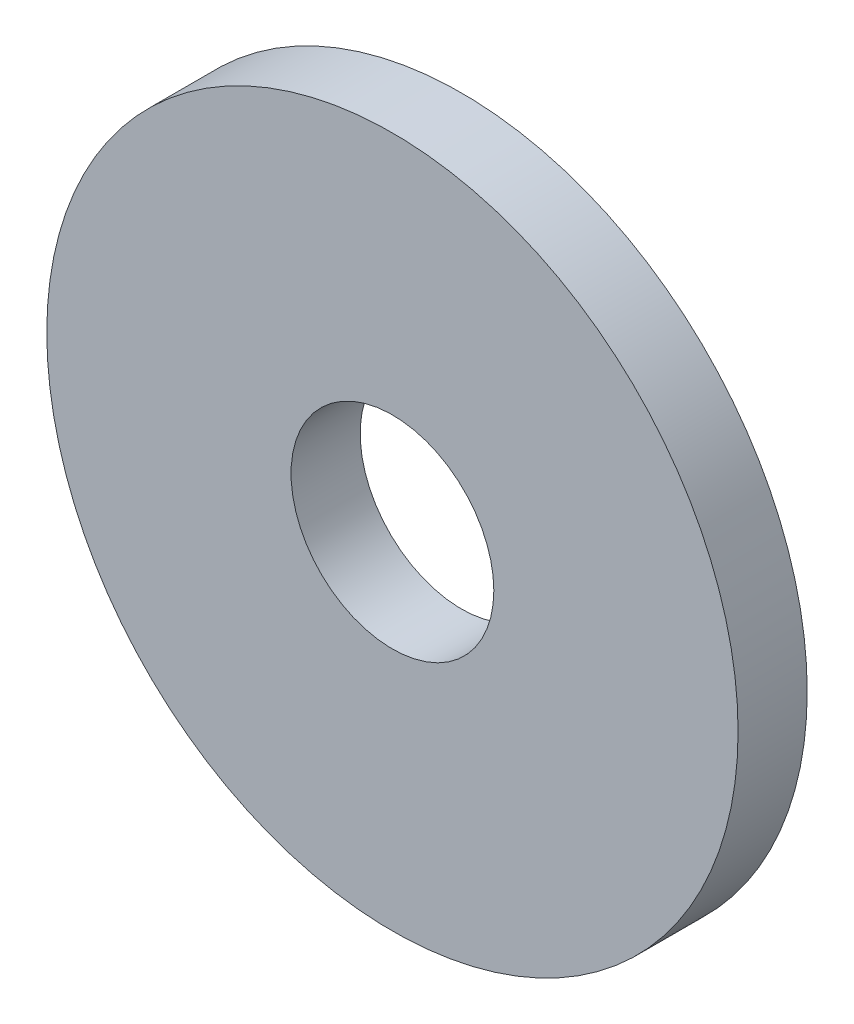
ISO-10303-21;
HEADER;
FILE_DESCRIPTION(('STEP AP214'),'2;1');
FILE_NAME('part.step','',(''),(''),'','','');
FILE_SCHEMA(('AUTOMOTIVE_DESIGN { 1 0 10303 214 1 1 1 1 }'));
ENDSEC;
DATA;
#1=APPLICATION_CONTEXT('core data for automotive mechanical design processes');
#2=APPLICATION_PROTOCOL_DEFINITION('international standard','automotive_design',2000,#1);
#3=PRODUCT_CONTEXT('',#1,'mechanical');
#4=PRODUCT('Part','Part','',(#3));
#5=PRODUCT_RELATED_PRODUCT_CATEGORY('part','',(#4));
#6=PRODUCT_DEFINITION_FORMATION('','',#4);
#7=PRODUCT_DEFINITION_CONTEXT('part definition',#1,'design');
#8=PRODUCT_DEFINITION('design','',#6,#7);
#9=PRODUCT_DEFINITION_SHAPE('','',#8);
#10=(LENGTH_UNIT() NAMED_UNIT(*) SI_UNIT(.MILLI.,.METRE.));
#11=(NAMED_UNIT(*) PLANE_ANGLE_UNIT() SI_UNIT($,.RADIAN.));
#12=(NAMED_UNIT(*) SI_UNIT($,.STERADIAN.) SOLID_ANGLE_UNIT());
#13=UNCERTAINTY_MEASURE_WITH_UNIT(LENGTH_MEASURE(1.E-05),#10,'distance_accuracy_value','');
#14=(GEOMETRIC_REPRESENTATION_CONTEXT(3) GLOBAL_UNCERTAINTY_ASSIGNED_CONTEXT((#13)) GLOBAL_UNIT_ASSIGNED_CONTEXT((#10,
#11,#12)) REPRESENTATION_CONTEXT('',''));
#15=CARTESIAN_POINT('',(0.,0.,0.));
#16=DIRECTION('',(0.,0.,1.));
#17=DIRECTION('',(1.,0.,0.));
#18=AXIS2_PLACEMENT_3D('',#15,#16,#17);
#19=CARTESIAN_POINT('',(0.,0.,3.));
#20=DIRECTION('',(0.,0.,1.));
#21=DIRECTION('',(1.,0.,0.));
#22=AXIS2_PLACEMENT_3D('',#19,#20,#21);
#23=PLANE('',#22);
#24=CARTESIAN_POINT('',(0.,0.,3.));
#25=DIRECTION('',(0.,0.,1.));
#26=DIRECTION('',(1.,0.,0.));
#27=AXIS2_PLACEMENT_3D('',#24,#25,#26);
#28=CIRCLE('',#27,15.);
#29=CARTESIAN_POINT('',(15.,0.,3.));
#30=VERTEX_POINT('',#29);
#31=EDGE_CURVE('E10',#30,#30,#28,.T.);
#32=ORIENTED_EDGE('',*,*,#31,.T.);
#33=EDGE_LOOP('',(#32));
#34=FACE_BOUND('',#33,.T.);
#35=CARTESIAN_POINT('',(0.,0.,3.));
#36=DIRECTION('',(0.,0.,1.));
#37=DIRECTION('',(1.,0.,0.));
#38=AXIS2_PLACEMENT_3D('',#35,#36,#37);
#39=CIRCLE('',#38,4.4);
#40=CARTESIAN_POINT('',(4.4,0.,3.));
#41=VERTEX_POINT('',#40);
#42=EDGE_CURVE('E58',#41,#41,#39,.T.);
#43=ORIENTED_EDGE('',*,*,#42,.F.);
#44=EDGE_LOOP('',(#43));
#45=FACE_BOUND('',#44,.T.);
#46=ADVANCED_FACE('F44',(#34,#45),#23,.T.);
#47=CARTESIAN_POINT('',(0.,0.,0.));
#48=DIRECTION('',(0.,0.,1.));
#49=DIRECTION('',(1.,0.,0.));
#50=AXIS2_PLACEMENT_3D('',#47,#48,#49);
#51=PLANE('',#50);
#52=CARTESIAN_POINT('',(0.,0.,0.));
#53=DIRECTION('',(0.,0.,1.));
#54=DIRECTION('',(1.,0.,0.));
#55=AXIS2_PLACEMENT_3D('',#52,#53,#54);
#56=CIRCLE('',#55,15.);
#57=CARTESIAN_POINT('',(15.,0.,0.));
#58=VERTEX_POINT('',#57);
#59=EDGE_CURVE('E48',#58,#58,#56,.T.);
#60=ORIENTED_EDGE('',*,*,#59,.F.);
#61=EDGE_LOOP('',(#60));
#62=FACE_BOUND('',#61,.T.);
#63=CARTESIAN_POINT('',(0.,0.,0.));
#64=DIRECTION('',(0.,0.,1.));
#65=DIRECTION('',(1.,0.,0.));
#66=AXIS2_PLACEMENT_3D('',#63,#64,#65);
#67=CIRCLE('',#66,4.4);
#68=CARTESIAN_POINT('',(4.4,0.,0.));
#69=VERTEX_POINT('',#68);
#70=EDGE_CURVE('E60',#69,#69,#67,.T.);
#71=ORIENTED_EDGE('',*,*,#70,.T.);
#72=EDGE_LOOP('',(#71));
#73=FACE_BOUND('',#72,.T.);
#74=ADVANCED_FACE('F73',(#62,#73),#51,.F.);
#75=CARTESIAN_POINT('',(0.,0.,3.));
#76=DIRECTION('',(0.,0.,-1.));
#77=DIRECTION('',(-1.,0.,0.));
#78=AXIS2_PLACEMENT_3D('',#75,#76,#77);
#79=CYLINDRICAL_SURFACE('',#78,15.);
#80=ORIENTED_EDGE('',*,*,#31,.F.);
#81=EDGE_LOOP('',(#80));
#82=FACE_BOUND('',#81,.T.);
#83=ORIENTED_EDGE('',*,*,#59,.T.);
#84=EDGE_LOOP('',(#83));
#85=FACE_BOUND('',#84,.T.);
#86=ADVANCED_FACE('F46',(#82,#85),#79,.T.);
#87=CARTESIAN_POINT('',(0.,0.,3.));
#88=DIRECTION('',(0.,0.,-1.));
#89=DIRECTION('',(-1.,0.,0.));
#90=AXIS2_PLACEMENT_3D('',#87,#88,#89);
#91=CYLINDRICAL_SURFACE('',#90,4.4);
#92=ORIENTED_EDGE('',*,*,#42,.T.);
#93=EDGE_LOOP('',(#92));
#94=FACE_BOUND('',#93,.T.);
#95=ORIENTED_EDGE('',*,*,#70,.F.);
#96=EDGE_LOOP('',(#95));
#97=FACE_BOUND('',#96,.T.);
#98=ADVANCED_FACE('F69',(#94,#97),#91,.F.);
#99=CLOSED_SHELL('',(#46,#74,#86,#98));
#100=MANIFOLD_SOLID_BREP('B2',#99);
#101=ADVANCED_BREP_SHAPE_REPRESENTATION('',(#18,#100),#14);
#102=SHAPE_DEFINITION_REPRESENTATION(#9,#101);
ENDSEC;
END-ISO-10303-21;
